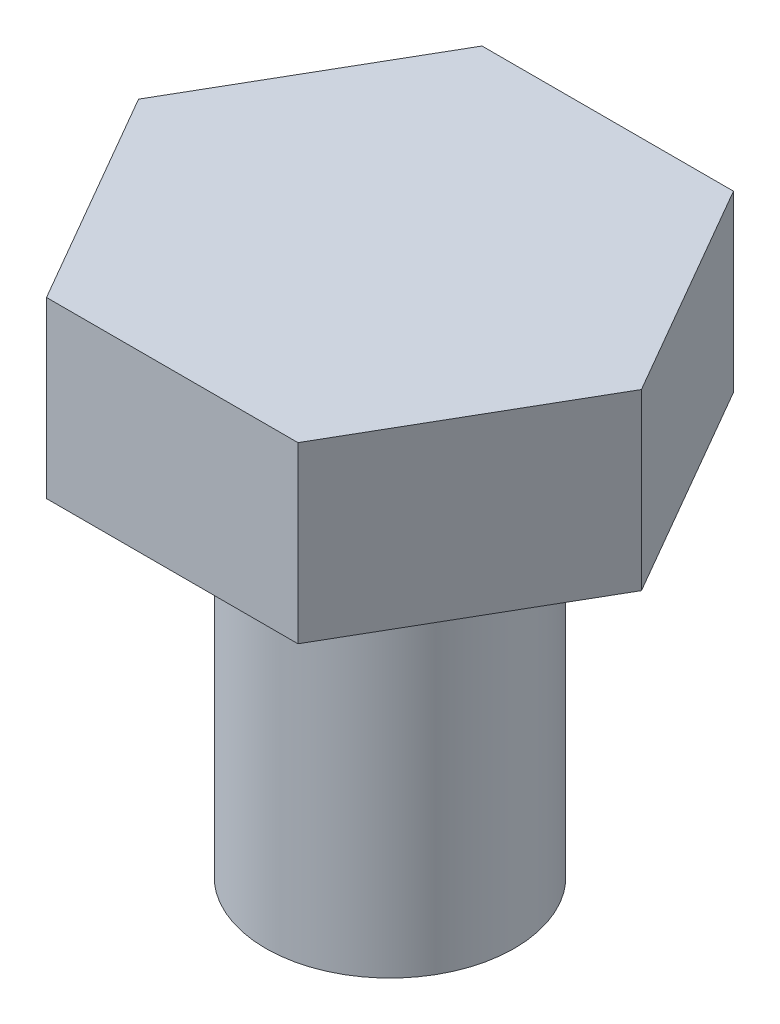
ISO-10303-21;
HEADER;
FILE_DESCRIPTION(('STEP AP214'),'2;1');
FILE_NAME('part.step','',(''),(''),'','','');
FILE_SCHEMA(('AUTOMOTIVE_DESIGN { 1 0 10303 214 1 1 1 1 }'));
ENDSEC;
DATA;
#1=APPLICATION_CONTEXT('core data for automotive mechanical design processes');
#2=APPLICATION_PROTOCOL_DEFINITION('international standard','automotive_design',2000,#1);
#3=PRODUCT_CONTEXT('',#1,'mechanical');
#4=PRODUCT('Part','Part','',(#3));
#5=PRODUCT_RELATED_PRODUCT_CATEGORY('part','',(#4));
#6=PRODUCT_DEFINITION_FORMATION('','',#4);
#7=PRODUCT_DEFINITION_CONTEXT('part definition',#1,'design');
#8=PRODUCT_DEFINITION('design','',#6,#7);
#9=PRODUCT_DEFINITION_SHAPE('','',#8);
#10=(LENGTH_UNIT() NAMED_UNIT(*) SI_UNIT(.MILLI.,.METRE.));
#11=(NAMED_UNIT(*) PLANE_ANGLE_UNIT() SI_UNIT($,.RADIAN.));
#12=(NAMED_UNIT(*) SI_UNIT($,.STERADIAN.) SOLID_ANGLE_UNIT());
#13=UNCERTAINTY_MEASURE_WITH_UNIT(LENGTH_MEASURE(1.E-05),#10,'distance_accuracy_value','');
#14=(GEOMETRIC_REPRESENTATION_CONTEXT(3) GLOBAL_UNCERTAINTY_ASSIGNED_CONTEXT((#13)) GLOBAL_UNIT_ASSIGNED_CONTEXT((#10,
#11,#12)) REPRESENTATION_CONTEXT('',''));
#15=CARTESIAN_POINT('',(0.,0.,0.));
#16=DIRECTION('',(0.,0.,1.));
#17=DIRECTION('',(1.,0.,0.));
#18=AXIS2_PLACEMENT_3D('',#15,#16,#17);
#19=CARTESIAN_POINT('',(0.,-6.,0.));
#20=DIRECTION('',(0.,1.,0.));
#21=DIRECTION('',(0.,0.,1.));
#22=AXIS2_PLACEMENT_3D('',#19,#20,#21);
#23=CYLINDRICAL_SURFACE('',#22,2.);
#24=CARTESIAN_POINT('',(0.,-6.,0.));
#25=DIRECTION('',(0.,1.,0.));
#26=DIRECTION('',(0.,0.,1.));
#27=AXIS2_PLACEMENT_3D('',#24,#25,#26);
#28=CIRCLE('',#27,2.);
#29=CARTESIAN_POINT('',(0.,-6.,2.));
#30=VERTEX_POINT('',#29);
#31=EDGE_CURVE('E50',#30,#30,#28,.T.);
#32=ORIENTED_EDGE('',*,*,#31,.T.);
#33=EDGE_LOOP('',(#32));
#34=FACE_BOUND('',#33,.T.);
#35=CARTESIAN_POINT('',(0.,-0.00999999999999959,0.));
#36=DIRECTION('',(0.,1.,0.));
#37=DIRECTION('',(0.,0.,1.));
#38=AXIS2_PLACEMENT_3D('',#35,#36,#37);
#39=CIRCLE('',#38,2.);
#40=CARTESIAN_POINT('',(0.,-0.00999999999999959,2.));
#41=VERTEX_POINT('',#40);
#42=EDGE_CURVE('E11',#41,#41,#39,.F.);
#43=ORIENTED_EDGE('',*,*,#42,.T.);
#44=EDGE_LOOP('',(#43));
#45=FACE_BOUND('',#44,.T.);
#46=ADVANCED_FACE('F40',(#34,#45),#23,.T.);
#47=ORIENTED_EDGE('',*,*,#42,.F.);
#48=EDGE_LOOP('',(#47));
#49=FACE_BOUND('',#48,.T.);
#50=CARTESIAN_POINT('',(0.,0.,0.));
#51=DIRECTION('',(0.,1.,0.));
#52=DIRECTION('',(0.,0.,1.));
#53=AXIS2_PLACEMENT_3D('',#50,#51,#52);
#54=CIRCLE('',#53,2.);
#55=CARTESIAN_POINT('',(0.,0.,2.));
#56=VERTEX_POINT('',#55);
#57=EDGE_CURVE('E146',#56,#56,#54,.T.);
#58=ORIENTED_EDGE('',*,*,#57,.F.);
#59=EDGE_LOOP('',(#58));
#60=FACE_BOUND('',#59,.T.);
#61=ADVANCED_FACE('F42',(#49,#60),#23,.T.);
#62=CARTESIAN_POINT('',(0.,-6.,0.));
#63=DIRECTION('',(0.,1.,0.));
#64=DIRECTION('',(0.,0.,1.));
#65=AXIS2_PLACEMENT_3D('',#62,#63,#64);
#66=PLANE('',#65);
#67=ORIENTED_EDGE('',*,*,#31,.F.);
#68=EDGE_LOOP('',(#67));
#69=FACE_BOUND('',#68,.T.);
#70=ADVANCED_FACE('F155',(#69),#66,.F.);
#71=CARTESIAN_POINT('',(-2.02072594216369,2.8,-3.5));
#72=DIRECTION('',(0.866025403784439,0.,0.5));
#73=DIRECTION('',(0.5,0.,-0.866025403784439));
#74=AXIS2_PLACEMENT_3D('',#71,#72,#73);
#75=PLANE('',#74);
#76=DIRECTION('',(-0.5,0.,0.866025403784438));
#77=VECTOR('',#76,1.);
#78=CARTESIAN_POINT('',(-2.02072594216369,0.,-3.5));
#79=LINE('',#78,#77);
#80=CARTESIAN_POINT('',(-2.02072594216369,0.,-3.5));
#81=VERTEX_POINT('',#80);
#82=CARTESIAN_POINT('',(-4.04145188432738,0.,0.));
#83=VERTEX_POINT('',#82);
#84=EDGE_CURVE('E127',#81,#83,#79,.T.);
#85=ORIENTED_EDGE('',*,*,#84,.T.);
#86=DIRECTION('',(0.,-1.,0.));
#87=VECTOR('',#86,1.);
#88=CARTESIAN_POINT('',(-4.04145188432738,2.8,0.));
#89=LINE('',#88,#87);
#90=CARTESIAN_POINT('',(-4.04145188432738,2.8,0.));
#91=VERTEX_POINT('',#90);
#92=EDGE_CURVE('E144',#91,#83,#89,.T.);
#93=ORIENTED_EDGE('',*,*,#92,.F.);
#94=DIRECTION('',(-0.5,0.,0.866025403784438));
#95=VECTOR('',#94,1.);
#96=CARTESIAN_POINT('',(-2.02072594216369,2.8,-3.5));
#97=LINE('',#96,#95);
#98=CARTESIAN_POINT('',(-2.02072594216369,2.8,-3.5));
#99=VERTEX_POINT('',#98);
#100=EDGE_CURVE('E137',#99,#91,#97,.T.);
#101=ORIENTED_EDGE('',*,*,#100,.F.);
#102=DIRECTION('',(0.,-1.,0.));
#103=VECTOR('',#102,1.);
#104=CARTESIAN_POINT('',(-2.02072594216369,2.8,-3.5));
#105=LINE('',#104,#103);
#106=EDGE_CURVE('E123',#99,#81,#105,.T.);
#107=ORIENTED_EDGE('',*,*,#106,.T.);
#108=EDGE_LOOP('',(#85,#93,#101,#107));
#109=FACE_BOUND('',#108,.T.);
#110=ADVANCED_FACE('F161',(#109),#75,.F.);
#111=CARTESIAN_POINT('',(-4.04145188432738,2.8,0.));
#112=DIRECTION('',(0.866025403784439,0.,-0.5));
#113=DIRECTION('',(-0.5,0.,-0.866025403784439));
#114=AXIS2_PLACEMENT_3D('',#111,#112,#113);
#115=PLANE('',#114);
#116=DIRECTION('',(0.5,0.,0.866025403784439));
#117=VECTOR('',#116,1.);
#118=CARTESIAN_POINT('',(-4.04145188432738,0.,0.));
#119=LINE('',#118,#117);
#120=CARTESIAN_POINT('',(-2.02072594216369,0.,3.5));
#121=VERTEX_POINT('',#120);
#122=EDGE_CURVE('E130',#83,#121,#119,.T.);
#123=ORIENTED_EDGE('',*,*,#122,.T.);
#124=DIRECTION('',(0.,-1.,0.));
#125=VECTOR('',#124,1.);
#126=CARTESIAN_POINT('',(-2.02072594216369,2.8,3.5));
#127=LINE('',#126,#125);
#128=CARTESIAN_POINT('',(-2.02072594216369,2.8,3.5));
#129=VERTEX_POINT('',#128);
#130=EDGE_CURVE('E141',#129,#121,#127,.T.);
#131=ORIENTED_EDGE('',*,*,#130,.F.);
#132=DIRECTION('',(0.5,0.,0.866025403784439));
#133=VECTOR('',#132,1.);
#134=CARTESIAN_POINT('',(-4.04145188432738,2.8,0.));
#135=LINE('',#134,#133);
#136=EDGE_CURVE('E96',#91,#129,#135,.T.);
#137=ORIENTED_EDGE('',*,*,#136,.F.);
#138=ORIENTED_EDGE('',*,*,#92,.T.);
#139=EDGE_LOOP('',(#123,#131,#137,#138));
#140=FACE_BOUND('',#139,.T.);
#141=ADVANCED_FACE('F186',(#140),#115,.F.);
#142=CARTESIAN_POINT('',(-2.02072594216369,2.8,3.5));
#143=DIRECTION('',(0.,0.,-1.));
#144=DIRECTION('',(-1.,0.,0.));
#145=AXIS2_PLACEMENT_3D('',#142,#143,#144);
#146=PLANE('',#145);
#147=DIRECTION('',(1.,0.,0.));
#148=VECTOR('',#147,1.);
#149=CARTESIAN_POINT('',(-2.02072594216369,0.,3.5));
#150=LINE('',#149,#148);
#151=CARTESIAN_POINT('',(2.02072594216369,0.,3.5));
#152=VERTEX_POINT('',#151);
#153=EDGE_CURVE('E132',#121,#152,#150,.T.);
#154=ORIENTED_EDGE('',*,*,#153,.T.);
#155=DIRECTION('',(0.,-1.,0.));
#156=VECTOR('',#155,1.);
#157=CARTESIAN_POINT('',(2.02072594216369,2.8,3.5));
#158=LINE('',#157,#156);
#159=CARTESIAN_POINT('',(2.02072594216369,2.8,3.5));
#160=VERTEX_POINT('',#159);
#161=EDGE_CURVE('E118',#160,#152,#158,.T.);
#162=ORIENTED_EDGE('',*,*,#161,.F.);
#163=DIRECTION('',(1.,0.,0.));
#164=VECTOR('',#163,1.);
#165=CARTESIAN_POINT('',(-2.02072594216369,2.8,3.5));
#166=LINE('',#165,#164);
#167=EDGE_CURVE('E109',#129,#160,#166,.T.);
#168=ORIENTED_EDGE('',*,*,#167,.F.);
#169=ORIENTED_EDGE('',*,*,#130,.T.);
#170=EDGE_LOOP('',(#154,#162,#168,#169));
#171=FACE_BOUND('',#170,.T.);
#172=ADVANCED_FACE('F194',(#171),#146,.F.);
#173=CARTESIAN_POINT('',(2.02072594216369,2.8,3.5));
#174=DIRECTION('',(-0.866025403784439,0.,-0.5));
#175=DIRECTION('',(-0.5,0.,0.866025403784439));
#176=AXIS2_PLACEMENT_3D('',#173,#174,#175);
#177=PLANE('',#176);
#178=DIRECTION('',(0.5,0.,-0.866025403784438));
#179=VECTOR('',#178,1.);
#180=CARTESIAN_POINT('',(2.02072594216369,0.,3.5));
#181=LINE('',#180,#179);
#182=CARTESIAN_POINT('',(4.04145188432738,0.,0.));
#183=VERTEX_POINT('',#182);
#184=EDGE_CURVE('E117',#152,#183,#181,.T.);
#185=ORIENTED_EDGE('',*,*,#184,.T.);
#186=DIRECTION('',(0.,-1.,0.));
#187=VECTOR('',#186,1.);
#188=CARTESIAN_POINT('',(4.04145188432738,2.8,0.));
#189=LINE('',#188,#187);
#190=CARTESIAN_POINT('',(4.04145188432738,2.8,0.));
#191=VERTEX_POINT('',#190);
#192=EDGE_CURVE('E114',#191,#183,#189,.T.);
#193=ORIENTED_EDGE('',*,*,#192,.F.);
#194=DIRECTION('',(0.5,0.,-0.866025403784438));
#195=VECTOR('',#194,1.);
#196=CARTESIAN_POINT('',(2.02072594216369,2.8,3.5));
#197=LINE('',#196,#195);
#198=EDGE_CURVE('E103',#160,#191,#197,.T.);
#199=ORIENTED_EDGE('',*,*,#198,.F.);
#200=ORIENTED_EDGE('',*,*,#161,.T.);
#201=EDGE_LOOP('',(#185,#193,#199,#200));
#202=FACE_BOUND('',#201,.T.);
#203=ADVANCED_FACE('F115',(#202),#177,.F.);
#204=CARTESIAN_POINT('',(4.04145188432738,2.8,0.));
#205=DIRECTION('',(-0.866025403784439,0.,0.5));
#206=DIRECTION('',(0.5,0.,0.866025403784439));
#207=AXIS2_PLACEMENT_3D('',#204,#205,#206);
#208=PLANE('',#207);
#209=DIRECTION('',(-0.5,0.,-0.866025403784439));
#210=VECTOR('',#209,1.);
#211=CARTESIAN_POINT('',(4.04145188432738,0.,0.));
#212=LINE('',#211,#210);
#213=CARTESIAN_POINT('',(2.02072594216369,0.,-3.5));
#214=VERTEX_POINT('',#213);
#215=EDGE_CURVE('E81',#183,#214,#212,.T.);
#216=ORIENTED_EDGE('',*,*,#215,.T.);
#217=DIRECTION('',(0.,-1.,0.));
#218=VECTOR('',#217,1.);
#219=CARTESIAN_POINT('',(2.02072594216369,2.8,-3.5));
#220=LINE('',#219,#218);
#221=CARTESIAN_POINT('',(2.02072594216369,2.8,-3.5));
#222=VERTEX_POINT('',#221);
#223=EDGE_CURVE('E119',#222,#214,#220,.T.);
#224=ORIENTED_EDGE('',*,*,#223,.F.);
#225=DIRECTION('',(-0.5,0.,-0.866025403784439));
#226=VECTOR('',#225,1.);
#227=CARTESIAN_POINT('',(4.04145188432738,2.8,0.));
#228=LINE('',#227,#226);
#229=EDGE_CURVE('E107',#191,#222,#228,.T.);
#230=ORIENTED_EDGE('',*,*,#229,.F.);
#231=ORIENTED_EDGE('',*,*,#192,.T.);
#232=EDGE_LOOP('',(#216,#224,#230,#231));
#233=FACE_BOUND('',#232,.T.);
#234=ADVANCED_FACE('F121',(#233),#208,.F.);
#235=CARTESIAN_POINT('',(2.02072594216369,2.8,-3.5));
#236=DIRECTION('',(0.,0.,1.));
#237=DIRECTION('',(1.,0.,0.));
#238=AXIS2_PLACEMENT_3D('',#235,#236,#237);
#239=PLANE('',#238);
#240=DIRECTION('',(-1.,0.,0.));
#241=VECTOR('',#240,1.);
#242=CARTESIAN_POINT('',(2.02072594216369,0.,-3.5));
#243=LINE('',#242,#241);
#244=EDGE_CURVE('E87',#214,#81,#243,.T.);
#245=ORIENTED_EDGE('',*,*,#244,.T.);
#246=ORIENTED_EDGE('',*,*,#106,.F.);
#247=DIRECTION('',(-1.,0.,0.));
#248=VECTOR('',#247,1.);
#249=CARTESIAN_POINT('',(2.02072594216369,2.8,-3.5));
#250=LINE('',#249,#248);
#251=EDGE_CURVE('E58',#222,#99,#250,.T.);
#252=ORIENTED_EDGE('',*,*,#251,.F.);
#253=ORIENTED_EDGE('',*,*,#223,.T.);
#254=EDGE_LOOP('',(#245,#246,#252,#253));
#255=FACE_BOUND('',#254,.T.);
#256=ADVANCED_FACE('F214',(#255),#239,.F.);
#257=CARTESIAN_POINT('',(0.,2.8,0.));
#258=DIRECTION('',(0.,1.,0.));
#259=DIRECTION('',(0.,0.,1.));
#260=AXIS2_PLACEMENT_3D('',#257,#258,#259);
#261=PLANE('',#260);
#262=ORIENTED_EDGE('',*,*,#100,.T.);
#263=ORIENTED_EDGE('',*,*,#136,.T.);
#264=ORIENTED_EDGE('',*,*,#167,.T.);
#265=ORIENTED_EDGE('',*,*,#198,.T.);
#266=ORIENTED_EDGE('',*,*,#229,.T.);
#267=ORIENTED_EDGE('',*,*,#251,.T.);
#268=EDGE_LOOP('',(#262,#263,#264,#265,#266,#267));
#269=FACE_BOUND('',#268,.T.);
#270=ADVANCED_FACE('F105',(#269),#261,.T.);
#271=CARTESIAN_POINT('',(0.,0.,0.));
#272=DIRECTION('',(0.,1.,0.));
#273=DIRECTION('',(0.,0.,1.));
#274=AXIS2_PLACEMENT_3D('',#271,#272,#273);
#275=PLANE('',#274);
#276=ORIENTED_EDGE('',*,*,#57,.T.);
#277=EDGE_LOOP('',(#276));
#278=FACE_BOUND('',#277,.T.);
#279=ORIENTED_EDGE('',*,*,#84,.F.);
#280=ORIENTED_EDGE('',*,*,#244,.F.);
#281=ORIENTED_EDGE('',*,*,#215,.F.);
#282=ORIENTED_EDGE('',*,*,#184,.F.);
#283=ORIENTED_EDGE('',*,*,#153,.F.);
#284=ORIENTED_EDGE('',*,*,#122,.F.);
#285=EDGE_LOOP('',(#279,#280,#281,#282,#283,#284));
#286=FACE_BOUND('',#285,.T.);
#287=ADVANCED_FACE('F151',(#278,#286),#275,.F.);
#288=CLOSED_SHELL('',(#46,#61,#70,#110,#141,#172,#203,#234,#256,#270,#287));
#289=MANIFOLD_SOLID_BREP('B2',#288);
#290=ADVANCED_BREP_SHAPE_REPRESENTATION('',(#18,#289),#14);
#291=SHAPE_DEFINITION_REPRESENTATION(#9,#290);
ENDSEC;
END-ISO-10303-21;
